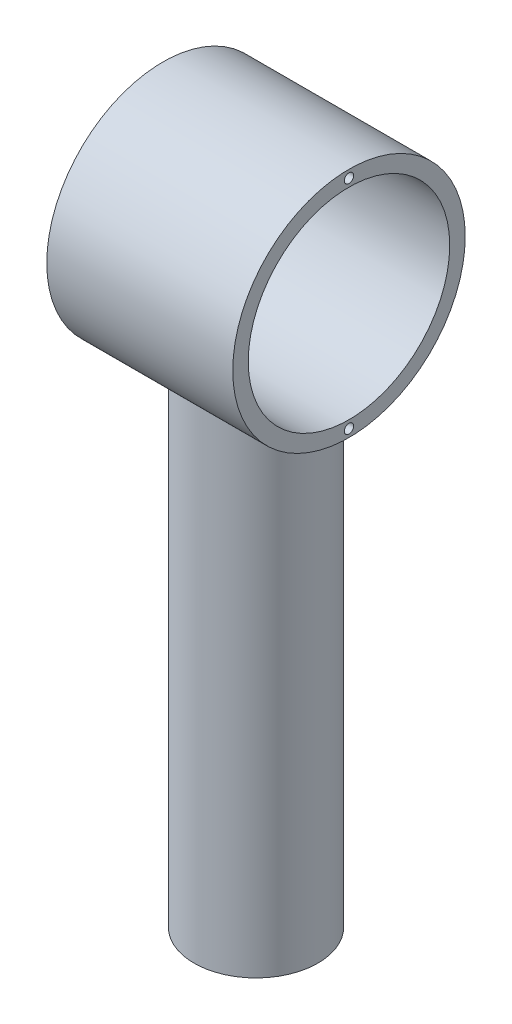
ISO-10303-21;
HEADER;
FILE_DESCRIPTION(('STEP AP214'),'2;1');
FILE_NAME('part.step','',(''),(''),'','','');
FILE_SCHEMA(('AUTOMOTIVE_DESIGN { 1 0 10303 214 1 1 1 1 }'));
ENDSEC;
DATA;
#1=APPLICATION_CONTEXT('core data for automotive mechanical design processes');
#2=APPLICATION_PROTOCOL_DEFINITION('international standard','automotive_design',2000,#1);
#3=PRODUCT_CONTEXT('',#1,'mechanical');
#4=PRODUCT('Part','Part','',(#3));
#5=PRODUCT_RELATED_PRODUCT_CATEGORY('part','',(#4));
#6=PRODUCT_DEFINITION_FORMATION('','',#4);
#7=PRODUCT_DEFINITION_CONTEXT('part definition',#1,'design');
#8=PRODUCT_DEFINITION('design','',#6,#7);
#9=PRODUCT_DEFINITION_SHAPE('','',#8);
#10=(LENGTH_UNIT() NAMED_UNIT(*) SI_UNIT(.MILLI.,.METRE.));
#11=(NAMED_UNIT(*) PLANE_ANGLE_UNIT() SI_UNIT($,.RADIAN.));
#12=(NAMED_UNIT(*) SI_UNIT($,.STERADIAN.) SOLID_ANGLE_UNIT());
#13=UNCERTAINTY_MEASURE_WITH_UNIT(LENGTH_MEASURE(1.E-05),#10,'distance_accuracy_value','');
#14=(GEOMETRIC_REPRESENTATION_CONTEXT(3) GLOBAL_UNCERTAINTY_ASSIGNED_CONTEXT((#13)) GLOBAL_UNIT_ASSIGNED_CONTEXT((#10,
#11,#12)) REPRESENTATION_CONTEXT('',''));
#15=CARTESIAN_POINT('',(0.,0.,0.));
#16=DIRECTION('',(0.,0.,1.));
#17=DIRECTION('',(1.,0.,0.));
#18=AXIS2_PLACEMENT_3D('',#15,#16,#17);
#19=CARTESIAN_POINT('',(30.,39.3347293897193,0.));
#20=DIRECTION('',(-1.,0.,0.));
#21=DIRECTION('',(0.,0.,1.));
#22=AXIS2_PLACEMENT_3D('',#19,#20,#21);
#23=CYLINDRICAL_SURFACE('',#22,37.5);
#24=CARTESIAN_POINT('',(0.,7.61328553859548,-20.));
#25=CARTESIAN_POINT('',(-0.51570182078703,7.6132880699644,-20.0000020694901));
#26=CARTESIAN_POINT('',(-1.03138048086282,7.60066823523603,-19.9800293716016));
#27=CARTESIAN_POINT('',(-2.05864988227541,7.55069636760927,-19.900438433849));
#28=CARTESIAN_POINT('',(-2.57023901293608,7.51333503324412,-19.8408052837619));
#29=CARTESIAN_POINT('',(-3.58588736208425,7.4152585886438,-19.6826321785822));
#30=CARTESIAN_POINT('',(-4.08993349078951,7.35450688776835,-19.5840312579613));
#31=CARTESIAN_POINT('',(-5.08606982289711,7.2119173548362,-19.3492573673804));
#32=CARTESIAN_POINT('',(-5.57816083404603,7.13008095172584,-19.2130869435256));
#33=CARTESIAN_POINT('',(-6.54451950031659,6.94867128669877,-18.9056831081237));
#34=CARTESIAN_POINT('',(-7.01887598033731,6.84920676482473,-18.7346637469901));
#35=CARTESIAN_POINT('',(-7.95042793399519,6.63528396459707,-18.3587310871486));
#36=CARTESIAN_POINT('',(-8.40762317654205,6.52082548443047,-18.1538173322254));
#37=CARTESIAN_POINT('',(-9.30288077314572,6.280113119196,-17.7117378683888));
#38=CARTESIAN_POINT('',(-9.7409430177589,6.15385916666921,-17.4745719750203));
#39=CARTESIAN_POINT('',(-10.5963194801134,5.89274883388715,-16.9695240952738));
#40=CARTESIAN_POINT('',(-11.0136317584403,5.75789165220258,-16.7016392454284));
#41=CARTESIAN_POINT('',(-11.8645739174769,5.46965896243555,-16.1097902433487));
#42=CARTESIAN_POINT('',(-12.2959988155331,5.31574005112918,-15.7829171398827));
#43=CARTESIAN_POINT('',(-13.1302687696288,5.00538236736176,-15.0959577863311));
#44=CARTESIAN_POINT('',(-13.5331236847503,4.84894448725216,-14.7358830932635));
#45=CARTESIAN_POINT('',(-14.3089302194614,4.53718321222723,-13.983797171619));
#46=CARTESIAN_POINT('',(-14.6818598793333,4.38186071053715,-13.5917629081743));
#47=CARTESIAN_POINT('',(-15.3955976257313,4.07610720045685,-12.7776616216099));
#48=CARTESIAN_POINT('',(-15.7364045621611,3.9256763673302,-12.3555935241317));
#49=CARTESIAN_POINT('',(-16.4096071243127,3.62159504628239,-11.4485193546584));
#50=CARTESIAN_POINT('',(-16.7391795739264,3.46863951891845,-10.9611773223788));
#51=CARTESIAN_POINT('',(-17.3557414498559,3.17677022398932,-9.95619250224608));
#52=CARTESIAN_POINT('',(-17.6427280097321,3.03785740183352,-9.43854767799109));
#53=CARTESIAN_POINT('',(-18.1710455089747,2.77814316417008,-8.37643552854965));
#54=CARTESIAN_POINT('',(-18.41240146501,2.65733183222565,-7.83198310803149));
#55=CARTESIAN_POINT('',(-18.8467311540172,2.43738288695592,-6.71989087808538));
#56=CARTESIAN_POINT('',(-19.0397108691608,2.33824259399959,-6.15225394574328));
#57=CARTESIAN_POINT('',(-19.3613843695543,2.17163162893653,-5.04409084493633));
#58=CARTESIAN_POINT('',(-19.4939561926983,2.10227597479069,-4.50497266267378));
#59=CARTESIAN_POINT('',(-19.7140932565086,1.98654763965169,-3.41518253756319));
#60=CARTESIAN_POINT('',(-19.8016606717114,1.9401738482179,-2.86451115428459));
#61=CARTESIAN_POINT('',(-19.9305089797469,1.87178493678521,-1.75660288316389));
#62=CARTESIAN_POINT('',(-19.9718172176824,1.84975542629783,-1.19937007105454));
#63=CARTESIAN_POINT('',(-20.0076218669366,1.83066715768317,-0.0829912230449223));
#64=CARTESIAN_POINT('',(-20.0021216831258,1.83360658330163,0.476154670739197));
#65=CARTESIAN_POINT('',(-19.9472644127489,1.86283417630171,1.53619969533));
#66=CARTESIAN_POINT('',(-19.9022922570022,1.88678776447231,2.03739765283052));
#67=CARTESIAN_POINT('',(-19.7749621587987,1.95430394753898,3.03364583244079));
#68=CARTESIAN_POINT('',(-19.6926072248326,1.99786496446631,3.52869654597525));
#69=CARTESIAN_POINT('',(-19.4914513891179,2.10356816382798,4.50931008296979));
#70=CARTESIAN_POINT('',(-19.3726492483943,2.16571097792434,4.99487258329354));
#71=CARTESIAN_POINT('',(-19.0998645810979,2.30715542449527,5.95344599270102));
#72=CARTESIAN_POINT('',(-18.9458807186661,2.38645770851321,6.42645642441812));
#73=CARTESIAN_POINT('',(-18.6021940192179,2.56151225269992,7.36274655171216));
#74=CARTESIAN_POINT('',(-18.4120876761664,2.65744915384273,7.82584330093237));
#75=CARTESIAN_POINT('',(-17.9990703595971,2.86303540513644,8.73397464778428));
#76=CARTESIAN_POINT('',(-17.7761594997008,2.97268470779299,9.17900930796887));
#77=CARTESIAN_POINT('',(-17.2992035665849,3.20345648806732,10.0490666696836));
#78=CARTESIAN_POINT('',(-17.0451518693495,3.32458140543233,10.4740850868216));
#79=CARTESIAN_POINT('',(-16.5076300698118,3.57587866384264,11.3022971689998));
#80=CARTESIAN_POINT('',(-16.2241573265239,3.70605181675742,11.7054888698094));
#81=CARTESIAN_POINT('',(-15.5985893577811,3.98674568958366,12.5291017597988));
#82=CARTESIAN_POINT('',(-15.2534633423082,4.13797742844741,12.9469820282129));
#83=CARTESIAN_POINT('',(-14.5313798049263,4.44484295747273,13.7525145719855));
#84=CARTESIAN_POINT('',(-14.1544203560153,4.60047701374398,14.1401650146785));
#85=CARTESIAN_POINT('',(-13.3701405977241,4.91262663007434,14.8839378037101));
#86=CARTESIAN_POINT('',(-12.9627935496855,5.06914285172146,15.2400317655331));
#87=CARTESIAN_POINT('',(-12.3307195861961,5.30153569487148,15.7488582454633));
#88=CARTESIAN_POINT('',(-12.116510807287,5.37860595092003,15.9142538119811));
#89=CARTESIAN_POINT('',(-11.681195108966,5.53149327670738,16.2364723560311));
#90=CARTESIAN_POINT('',(-11.460086037774,5.60730994402196,16.3932926166317));
#91=CARTESIAN_POINT('',(-10.7512386458969,5.84397514109671,16.8746465090342));
#92=CARTESIAN_POINT('',(-10.2513083612089,6.00159901702219,17.1830498160679));
#93=CARTESIAN_POINT('',(-9.22309815410546,6.30331720299424,17.7561472395889));
#94=CARTESIAN_POINT('',(-8.69482088095189,6.44741277392444,18.0208454312885));
#95=CARTESIAN_POINT('',(-7.88366626468449,6.64935618490528,18.3830210735658));
#96=CARTESIAN_POINT('',(-7.61021828324999,6.71429172444382,18.497913664606));
#97=CARTESIAN_POINT('',(-7.05750140500056,6.83879429917899,18.715766604051));
#98=CARTESIAN_POINT('',(-6.77823400271512,6.89836269233171,18.8187299725957));
#99=CARTESIAN_POINT('',(-5.93231320321243,7.0680650478359,19.1092351768966));
#100=CARTESIAN_POINT('',(-5.35737558916738,7.16923807530391,19.2784662419717));
#101=CARTESIAN_POINT('',(-4.23790937229369,7.33584327360834,19.553644852043));
#102=CARTESIAN_POINT('',(-3.69469269630252,7.40350754882363,19.6636096891331));
#103=CARTESIAN_POINT('',(-2.59831392694322,7.51172052869058,19.8382645405692));
#104=CARTESIAN_POINT('',(-2.04515244738685,7.55227090100259,19.9029573394163));
#105=CARTESIAN_POINT('',(-0.934456021777517,7.60436975146174,19.985912455731));
#106=CARTESIAN_POINT('',(-0.376925082364807,7.61594224913097,20.0042132273243));
#107=CARTESIAN_POINT('',(0.737521490785031,7.60960405604995,19.9941613677195));
#108=CARTESIAN_POINT('',(1.29443717682133,7.59169610124954,19.9658130658148));
#109=CARTESIAN_POINT('',(2.32861782358089,7.53154939769093,19.8698354015943));
#110=CARTESIAN_POINT('',(2.80663609459942,7.49285872051378,19.807924313161));
#111=CARTESIAN_POINT('',(3.75490327816776,7.39530343572092,19.6502332853426));
#112=CARTESIAN_POINT('',(4.22515302415459,7.33644100713542,19.5544570041705));
#113=CARTESIAN_POINT('',(5.15517852611524,7.20041592332948,19.3301078005834));
#114=CARTESIAN_POINT('',(5.6149510025583,7.12324762206767,19.201524758723));
#115=CARTESIAN_POINT('',(6.52146009102425,6.95292610209488,18.9128757451853));
#116=CARTESIAN_POINT('',(6.9681958338559,6.85977182039513,18.7528076798059));
#117=CARTESIAN_POINT('',(7.86590665438222,6.65563689578103,18.394868382629));
#118=CARTESIAN_POINT('',(8.31620402945305,6.54405241736956,18.1956441409796));
#119=CARTESIAN_POINT('',(9.19863635779434,6.30922572449742,17.7658681503462));
#120=CARTESIAN_POINT('',(9.63076356428131,6.18597860906466,17.5353032131866));
#121=CARTESIAN_POINT('',(10.4751592846687,5.9308834237878,17.0443420482752));
#122=CARTESIAN_POINT('',(10.8874241815632,5.79903379760681,16.7839404160909));
#123=CARTESIAN_POINT('',(11.6906450394737,5.52972993234768,16.234702654998));
#124=CARTESIAN_POINT('',(12.0815992232859,5.39227522750069,15.9458641602208));
#125=CARTESIAN_POINT('',(12.8968327162095,5.09419926730205,15.2964635816017));
#126=CARTESIAN_POINT('',(13.3175400727492,4.93314757086699,14.931603315024));
#127=CARTESIAN_POINT('',(14.1272437684801,4.61166900271007,14.167947195493));
#128=CARTESIAN_POINT('',(14.5162373768361,4.45124218592611,13.7691484261636));
#129=CARTESIAN_POINT('',(15.260632807053,4.13496611295089,12.9392398085584));
#130=CARTESIAN_POINT('',(15.6160178550132,3.97911916902201,12.5081140164347));
#131=CARTESIAN_POINT('',(16.2907536419708,3.67596031043994,11.6156902573406));
#132=CARTESIAN_POINT('',(16.610104394801,3.52864839251033,11.154392301953));
#133=CARTESIAN_POINT('',(17.2229254898073,3.24036680527126,10.183991767619));
#134=CARTESIAN_POINT('',(17.514759715978,3.09991832994598,9.67369760070825));
#135=CARTESIAN_POINT('',(18.0538993037871,2.83626399048115,8.62576948259296));
#136=CARTESIAN_POINT('',(18.3012025928681,2.71305892894344,8.08813426037458));
#137=CARTESIAN_POINT('',(18.7482234390732,2.48763118452518,6.98966501489584));
#138=CARTESIAN_POINT('',(18.9479790657331,2.38539172446142,6.42884997594815));
#139=CARTESIAN_POINT('',(19.297455902112,2.20496544127273,5.28809092848529));
#140=CARTESIAN_POINT('',(19.4471840388594,2.12677528829321,4.70814958051198));
#141=CARTESIAN_POINT('',(19.6821437839116,2.00340406914947,3.59240502635107));
#142=CARTESIAN_POINT('',(19.772289467478,1.95572325345381,3.05790886541163));
#143=CARTESIAN_POINT('',(19.9089530850035,1.88325369864124,1.98183214986327));
#144=CARTESIAN_POINT('',(19.9554739590957,1.85846341679803,1.44025207517587));
#145=CARTESIAN_POINT('',(20.0042303784103,1.83247863443271,0.354749121186357));
#146=CARTESIAN_POINT('',(20.0064830368679,1.83127501576367,-0.189172771475614));
#147=CARTESIAN_POINT('',(19.9667133892609,1.85247557522932,-1.27491994456974));
#148=CARTESIAN_POINT('',(19.924692919087,1.87487877445111,-1.81674531100427));
#149=CARTESIAN_POINT('',(19.8021741343333,1.93989452502643,-2.84994112337194));
#150=CARTESIAN_POINT('',(19.7250802887853,1.98071677905486,-3.34183352060926));
#151=CARTESIAN_POINT('',(19.5349170787364,2.08078402472055,-4.31666546450881));
#152=CARTESIAN_POINT('',(19.4218501893373,2.14002774887424,-4.79960562470527));
#153=CARTESIAN_POINT('',(19.1609304561323,2.2756030999327,-5.75354734954822));
#154=CARTESIAN_POINT('',(19.013075402407,2.35193581240119,-6.22454815364019));
#155=CARTESIAN_POINT('',(18.6840113486702,2.52002741658279,-7.15191066342813));
#156=CARTESIAN_POINT('',(18.5028007591816,2.61178704341008,-7.60827167028258));
#157=CARTESIAN_POINT('',(18.1011724085677,2.81252984845167,-8.52087859171125));
#158=CARTESIAN_POINT('',(17.8795354415977,2.9220313921495,-8.97647337098125));
#159=CARTESIAN_POINT('',(17.4038544118732,3.1532292750963,-9.86715686443598));
#160=CARTESIAN_POINT('',(17.1498098908654,3.27492578678086,-10.302245288535));
#161=CARTESIAN_POINT('',(16.6110188950497,3.52803481329824,-11.1501774118709));
#162=CARTESIAN_POINT('',(16.326263208179,3.65945023966245,-11.5630143806002));
#163=CARTESIAN_POINT('',(15.7278002398746,3.92932914281693,-12.364731365233));
#164=CARTESIAN_POINT('',(15.4140900152394,4.06779333546474,-12.7536089389721));
#165=CARTESIAN_POINT('',(14.7231741657298,4.36454119290665,-13.5475000625257));
#166=CARTESIAN_POINT('',(14.3427819832896,4.52332570635551,-13.9495579337108));
#167=CARTESIAN_POINT('',(13.5503054853644,4.8422779960791,-14.7205601593971));
#168=CARTESIAN_POINT('',(13.1382187825437,5.00244587574532,-15.0895020149462));
#169=CARTESIAN_POINT('',(12.2838013095431,5.32025654018632,-15.7928698949614));
#170=CARTESIAN_POINT('',(11.8414372203949,5.47789629962482,-16.1272568440539));
#171=CARTESIAN_POINT('',(10.928825106116,5.78618549533389,-16.7591408544251));
#172=CARTESIAN_POINT('',(10.4585786781072,5.93683533111324,-17.0566400256525));
#173=CARTESIAN_POINT('',(9.4660459672117,6.23457796367636,-17.6277979510643));
#174=CARTESIAN_POINT('',(8.94232063328413,6.3810371109805,-17.8992953962635));
#175=CARTESIAN_POINT('',(7.86886091086252,6.65599199411329,-18.3964918948525));
#176=CARTESIAN_POINT('',(7.31912211873666,6.78448467386223,-18.6221831595937));
#177=CARTESIAN_POINT('',(6.19886278931986,7.01791071629903,-19.024384907481));
#178=CARTESIAN_POINT('',(5.62840595658142,7.12291019016861,-19.201033745358));
#179=CARTESIAN_POINT('',(4.47007390274586,7.30497875372796,-19.5032386917275));
#180=CARTESIAN_POINT('',(3.88221048468111,7.3820663210496,-19.6288286079236));
#181=CARTESIAN_POINT('',(2.7470780378961,7.49911189520011,-19.8180391560448));
#182=CARTESIAN_POINT('',(2.20083618219898,7.54175781178129,-19.8861700850289));
#183=CARTESIAN_POINT('',(1.10305418721149,7.59884381135044,-19.9771502535946));
#184=CARTESIAN_POINT('',(0.55151384904951,7.61328283143998,-19.9999977867977));
#185=CARTESIAN_POINT('',(0.,7.61328553859548,-20.));
#186=B_SPLINE_CURVE_WITH_KNOTS('',3,(#24,#25,#26,#27,#28,#29,#30,#31,#32,#33,#34,#35,#36,#37,
#38,#39,#40,#41,#42,#43,#44,#45,#46,#47,#48,#49,#50,#51,#52,#53,#54,#55,#56,#57,#58,#59,#60,#61,
#62,#63,#64,#65,#66,#67,#68,#69,#70,#71,#72,#73,#74,#75,#76,#77,#78,#79,#80,#81,#82,#83,#84,#85,
#86,#87,#88,#89,#90,#91,#92,#93,#94,#95,#96,#97,#98,#99,#100,#101,#102,#103,#104,#105,#106,#107,
#108,#109,#110,#111,#112,#113,#114,#115,#116,#117,#118,#119,#120,#121,#122,#123,#124,#125,#126,
#127,#128,#129,#130,#131,#132,#133,#134,#135,#136,#137,#138,#139,#140,#141,#142,#143,#144,#145,
#146,#147,#148,#149,#150,#151,#152,#153,#154,#155,#156,#157,#158,#159,#160,#161,#162,#163,#164,
#165,#166,#167,#168,#169,#170,#171,#172,#173,#174,#175,#176,#177,#178,#179,#180,#181,#182,#183,
#184,#185),.UNSPECIFIED.,.T.,.F.,(4,2,2,2,2,2,2,2,2,2,2,2,2,2,2,2,2,2,2,2,2,2,2,2,2,2,2,2,2,2,2,
2,2,2,2,2,2,2,2,2,2,2,2,2,2,2,2,2,2,2,2,2,2,2,2,2,2,2,2,2,2,2,2,2,2,2,2,2,2,2,2,2,2,2,2,2,2,2,2,
2,4),(0.,1.54653102412566,3.0936437906582,4.6431866763651,6.19262457451161,7.73281777044317,
9.27303169891885,10.8132544364963,12.3536208628203,14.040050545629,15.7258954056102,
17.4129662674639,19.1000975089252,20.9213689398888,22.7427629043674,24.5631553877423,
26.3833226515055,28.059489973695,29.7355762987162,31.4106713180379,33.0856444910623,
34.5951981761441,36.1046303969191,37.6141139345514,39.1236547971856,40.6511712473975,
42.1786824070403,43.7065190516389,45.2344929615787,46.9207293716491,48.6070679294707,
50.2949082420574,51.1388926875629,51.9831430032304,53.8052600800145,55.6272071603968,
56.5377943533881,57.448150505485,59.2683063920866,60.9409458022714,62.6134823260862,
64.2846320385256,65.9556266677268,67.4046488518205,68.853514556278,70.3028277136487,
71.7522372805584,73.2653941231695,74.7791896853173,76.2932598817077,77.8074561511926,
79.544658326591,81.2820099328677,83.0202241182139,84.7584376362927,86.5691871795349,
88.3800209768545,90.189399997079,91.9985283787263,93.628739619584,95.2588409829981,
96.8883121683758,98.5177157865105,100.014703624748,101.511588485983,103.008568462574,
104.505619792595,106.059030766784,107.612463709144,109.166363919111,110.720422255902,
112.445990412954,114.171688673013,115.899317510118,117.626847482728,119.447862072683,
121.269186039717,123.085318370938,124.900246218139,126.554111116078,128.208038334114),.UNSPECIFIED.);
#187=CARTESIAN_POINT('',(0.,7.61328553859548,-20.));
#188=VERTEX_POINT('',#187);
#189=EDGE_CURVE('E12',#188,#188,#186,.T.);
#190=ORIENTED_EDGE('',*,*,#189,.T.);
#191=EDGE_LOOP('',(#190));
#192=FACE_BOUND('',#191,.T.);
#193=CARTESIAN_POINT('',(-30.,39.3347293897193,0.));
#194=DIRECTION('',(1.,0.,0.));
#195=DIRECTION('',(0.,0.,-1.));
#196=AXIS2_PLACEMENT_3D('',#193,#194,#195);
#197=CIRCLE('',#196,37.5);
#198=CARTESIAN_POINT('',(-30.,39.3347293897193,-37.5));
#199=VERTEX_POINT('',#198);
#200=EDGE_CURVE('E122',#199,#199,#197,.T.);
#201=ORIENTED_EDGE('',*,*,#200,.T.);
#202=EDGE_LOOP('',(#201));
#203=FACE_BOUND('',#202,.T.);
#204=CARTESIAN_POINT('',(30.,39.3347293897193,0.));
#205=DIRECTION('',(1.,0.,0.));
#206=DIRECTION('',(0.,0.,-1.));
#207=AXIS2_PLACEMENT_3D('',#204,#205,#206);
#208=CIRCLE('',#207,37.5);
#209=CARTESIAN_POINT('',(30.,39.3347293897193,-37.5));
#210=VERTEX_POINT('',#209);
#211=EDGE_CURVE('E346',#210,#210,#208,.T.);
#212=ORIENTED_EDGE('',*,*,#211,.F.);
#213=EDGE_LOOP('',(#212));
#214=FACE_BOUND('',#213,.T.);
#215=ADVANCED_FACE('F49',(#192,#203,#214),#23,.T.);
#216=CARTESIAN_POINT('',(0.,25.,0.));
#217=DIRECTION('',(0.,-1.,0.));
#218=DIRECTION('',(0.,0.,-1.));
#219=AXIS2_PLACEMENT_3D('',#216,#217,#218);
#220=CYLINDRICAL_SURFACE('',#219,20.);
#221=CARTESIAN_POINT('',(0.,-150.,0.));
#222=DIRECTION('',(0.,-1.,0.));
#223=DIRECTION('',(0.,0.,-1.));
#224=AXIS2_PLACEMENT_3D('',#221,#222,#223);
#225=CIRCLE('',#224,20.);
#226=CARTESIAN_POINT('',(0.,-150.,-20.));
#227=VERTEX_POINT('',#226);
#228=EDGE_CURVE('E145',#227,#227,#225,.T.);
#229=ORIENTED_EDGE('',*,*,#228,.F.);
#230=EDGE_LOOP('',(#229));
#231=FACE_BOUND('',#230,.T.);
#232=ORIENTED_EDGE('',*,*,#189,.F.);
#233=EDGE_LOOP('',(#232));
#234=FACE_BOUND('',#233,.T.);
#235=ADVANCED_FACE('F51',(#231,#234),#220,.T.);
#236=CARTESIAN_POINT('',(12.5,-75.,0.));
#237=DIRECTION('',(1.,0.,0.));
#238=DIRECTION('',(0.,0.,-1.));
#239=AXIS2_PLACEMENT_3D('',#236,#237,#238);
#240=PLANE('',#239);
#241=DIRECTION('',(0.,-1.,0.));
#242=VECTOR('',#241,1.);
#243=CARTESIAN_POINT('',(12.5,-75.,-7.21687836487032));
#244=LINE('',#243,#242);
#245=CARTESIAN_POINT('',(12.5,-75.,-7.21687836487032));
#246=VERTEX_POINT('',#245);
#247=CARTESIAN_POINT('',(12.5,-150.,-7.2168783648703));
#248=VERTEX_POINT('',#247);
#249=EDGE_CURVE('E63',#246,#248,#244,.T.);
#250=ORIENTED_EDGE('',*,*,#249,.T.);
#251=DIRECTION('',(0.,0.,1.));
#252=VECTOR('',#251,1.);
#253=CARTESIAN_POINT('',(12.5,-150.,-7.2168783648703));
#254=LINE('',#253,#252);
#255=CARTESIAN_POINT('',(12.5,-150.,7.21687836487038));
#256=VERTEX_POINT('',#255);
#257=EDGE_CURVE('E127',#248,#256,#254,.T.);
#258=ORIENTED_EDGE('',*,*,#257,.T.);
#259=DIRECTION('',(0.,-1.,0.));
#260=VECTOR('',#259,1.);
#261=CARTESIAN_POINT('',(12.5,-75.,7.21687836487033));
#262=LINE('',#261,#260);
#263=CARTESIAN_POINT('',(12.5,-75.,7.21687836487033));
#264=VERTEX_POINT('',#263);
#265=EDGE_CURVE('E170',#264,#256,#262,.T.);
#266=ORIENTED_EDGE('',*,*,#265,.F.);
#267=DIRECTION('',(0.,0.,1.));
#268=VECTOR('',#267,1.);
#269=CARTESIAN_POINT('',(12.5,-75.,0.));
#270=LINE('',#269,#268);
#271=EDGE_CURVE('E149',#246,#264,#270,.T.);
#272=ORIENTED_EDGE('',*,*,#271,.F.);
#273=EDGE_LOOP('',(#250,#258,#266,#272));
#274=FACE_BOUND('',#273,.T.);
#275=ADVANCED_FACE('F186',(#274),#240,.F.);
#276=CARTESIAN_POINT('',(6.25,-75.,-10.8253175473055));
#277=DIRECTION('',(0.5,0.,-0.866025403784439));
#278=DIRECTION('',(-0.866025403784439,0.,-0.5));
#279=AXIS2_PLACEMENT_3D('',#276,#277,#278);
#280=PLANE('',#279);
#281=DIRECTION('',(0.,-1.,0.));
#282=VECTOR('',#281,1.);
#283=CARTESIAN_POINT('',(0.,-75.,-14.4337567297407));
#284=LINE('',#283,#282);
#285=CARTESIAN_POINT('',(0.,-75.,-14.4337567297407));
#286=VERTEX_POINT('',#285);
#287=CARTESIAN_POINT('',(0.,-150.,-14.4337567297407));
#288=VERTEX_POINT('',#287);
#289=EDGE_CURVE('E77',#286,#288,#284,.T.);
#290=ORIENTED_EDGE('',*,*,#289,.T.);
#291=DIRECTION('',(0.866025403784438,0.,0.500000000000001));
#292=VECTOR('',#291,1.);
#293=CARTESIAN_POINT('',(0.,-150.,-14.4337567297407));
#294=LINE('',#293,#292);
#295=EDGE_CURVE('E108',#288,#248,#294,.T.);
#296=ORIENTED_EDGE('',*,*,#295,.T.);
#297=ORIENTED_EDGE('',*,*,#249,.F.);
#298=DIRECTION('',(0.866025403784439,0.,0.5));
#299=VECTOR('',#298,1.);
#300=CARTESIAN_POINT('',(6.25,-75.,-10.8253175473055));
#301=LINE('',#300,#299);
#302=EDGE_CURVE('E111',#286,#246,#301,.T.);
#303=ORIENTED_EDGE('',*,*,#302,.F.);
#304=EDGE_LOOP('',(#290,#296,#297,#303));
#305=FACE_BOUND('',#304,.T.);
#306=ADVANCED_FACE('F106',(#305),#280,.F.);
#307=CARTESIAN_POINT('',(-6.25000000000001,-75.,-10.8253175473055));
#308=DIRECTION('',(-0.5,0.,-0.866025403784438));
#309=DIRECTION('',(-0.866025403784439,0.,0.5));
#310=AXIS2_PLACEMENT_3D('',#307,#308,#309);
#311=PLANE('',#310);
#312=DIRECTION('',(0.,-1.,0.));
#313=VECTOR('',#312,1.);
#314=CARTESIAN_POINT('',(-12.5,-75.,-7.21687836487032));
#315=LINE('',#314,#313);
#316=CARTESIAN_POINT('',(-12.5,-75.,-7.21687836487032));
#317=VERTEX_POINT('',#316);
#318=CARTESIAN_POINT('',(-12.4999999999999,-150.,-7.21687836487047));
#319=VERTEX_POINT('',#318);
#320=EDGE_CURVE('E113',#317,#319,#315,.T.);
#321=ORIENTED_EDGE('',*,*,#320,.T.);
#322=DIRECTION('',(0.866025403784441,0.,-0.499999999999995));
#323=VECTOR('',#322,1.);
#324=CARTESIAN_POINT('',(-12.4999999999999,-150.,-7.21687836487047));
#325=LINE('',#324,#323);
#326=EDGE_CURVE('E116',#319,#288,#325,.T.);
#327=ORIENTED_EDGE('',*,*,#326,.T.);
#328=ORIENTED_EDGE('',*,*,#289,.F.);
#329=DIRECTION('',(0.866025403784439,0.,-0.5));
#330=VECTOR('',#329,1.);
#331=CARTESIAN_POINT('',(-6.25000000000001,-75.,-10.8253175473055));
#332=LINE('',#331,#330);
#333=EDGE_CURVE('E165',#317,#286,#332,.T.);
#334=ORIENTED_EDGE('',*,*,#333,.F.);
#335=EDGE_LOOP('',(#321,#327,#328,#334));
#336=FACE_BOUND('',#335,.T.);
#337=ADVANCED_FACE('F117',(#336),#311,.F.);
#338=CARTESIAN_POINT('',(-12.5,-75.,0.));
#339=DIRECTION('',(-1.,0.,0.));
#340=DIRECTION('',(0.,0.,1.));
#341=AXIS2_PLACEMENT_3D('',#338,#339,#340);
#342=PLANE('',#341);
#343=DIRECTION('',(0.,-1.,0.));
#344=VECTOR('',#343,1.);
#345=CARTESIAN_POINT('',(-12.5,-75.,7.21687836487033));
#346=LINE('',#345,#344);
#347=CARTESIAN_POINT('',(-12.5,-75.,7.21687836487033));
#348=VERTEX_POINT('',#347);
#349=CARTESIAN_POINT('',(-12.5000000000001,-150.,7.21687836487021));
#350=VERTEX_POINT('',#349);
#351=EDGE_CURVE('E175',#348,#350,#346,.T.);
#352=ORIENTED_EDGE('',*,*,#351,.T.);
#353=DIRECTION('',(0.,0.,-1.));
#354=VECTOR('',#353,1.);
#355=CARTESIAN_POINT('',(-12.5000000000001,-150.,7.21687836487021));
#356=LINE('',#355,#354);
#357=EDGE_CURVE('E142',#350,#319,#356,.T.);
#358=ORIENTED_EDGE('',*,*,#357,.T.);
#359=ORIENTED_EDGE('',*,*,#320,.F.);
#360=DIRECTION('',(0.,0.,-1.));
#361=VECTOR('',#360,1.);
#362=CARTESIAN_POINT('',(-12.5,-75.,0.));
#363=LINE('',#362,#361);
#364=EDGE_CURVE('E161',#348,#317,#363,.T.);
#365=ORIENTED_EDGE('',*,*,#364,.F.);
#366=EDGE_LOOP('',(#352,#358,#359,#365));
#367=FACE_BOUND('',#366,.T.);
#368=ADVANCED_FACE('F194',(#367),#342,.F.);
#369=CARTESIAN_POINT('',(-6.25,-75.,10.8253175473055));
#370=DIRECTION('',(-0.5,0.,0.866025403784439));
#371=DIRECTION('',(0.866025403784439,0.,0.5));
#372=AXIS2_PLACEMENT_3D('',#369,#370,#371);
#373=PLANE('',#372);
#374=DIRECTION('',(0.,-1.,0.));
#375=VECTOR('',#374,1.);
#376=CARTESIAN_POINT('',(0.,-75.,14.4337567297406));
#377=LINE('',#376,#375);
#378=CARTESIAN_POINT('',(0.,-75.,14.4337567297406));
#379=VERTEX_POINT('',#378);
#380=CARTESIAN_POINT('',(0.,-150.,14.4337567297407));
#381=VERTEX_POINT('',#380);
#382=EDGE_CURVE('E178',#379,#381,#377,.T.);
#383=ORIENTED_EDGE('',*,*,#382,.T.);
#384=DIRECTION('',(-0.866025403784435,0.,-0.500000000000007));
#385=VECTOR('',#384,1.);
#386=CARTESIAN_POINT('',(0.,-150.,14.4337567297407));
#387=LINE('',#386,#385);
#388=EDGE_CURVE('E138',#381,#350,#387,.T.);
#389=ORIENTED_EDGE('',*,*,#388,.T.);
#390=ORIENTED_EDGE('',*,*,#351,.F.);
#391=DIRECTION('',(-0.866025403784439,0.,-0.5));
#392=VECTOR('',#391,1.);
#393=CARTESIAN_POINT('',(-6.25,-75.,10.8253175473055));
#394=LINE('',#393,#392);
#395=EDGE_CURVE('E157',#379,#348,#394,.T.);
#396=ORIENTED_EDGE('',*,*,#395,.F.);
#397=EDGE_LOOP('',(#383,#389,#390,#396));
#398=FACE_BOUND('',#397,.T.);
#399=ADVANCED_FACE('F188',(#398),#373,.F.);
#400=CARTESIAN_POINT('',(6.25000000000001,-75.,10.8253175473055));
#401=DIRECTION('',(0.5,0.,0.866025403784439));
#402=DIRECTION('',(0.866025403784439,0.,-0.5));
#403=AXIS2_PLACEMENT_3D('',#400,#401,#402);
#404=PLANE('',#403);
#405=ORIENTED_EDGE('',*,*,#265,.T.);
#406=DIRECTION('',(-0.866025403784441,0.,0.499999999999995));
#407=VECTOR('',#406,1.);
#408=CARTESIAN_POINT('',(12.5,-150.,7.21687836487038));
#409=LINE('',#408,#407);
#410=EDGE_CURVE('E131',#256,#381,#409,.T.);
#411=ORIENTED_EDGE('',*,*,#410,.T.);
#412=ORIENTED_EDGE('',*,*,#382,.F.);
#413=DIRECTION('',(-0.866025403784439,0.,0.5));
#414=VECTOR('',#413,1.);
#415=CARTESIAN_POINT('',(6.25000000000001,-75.,10.8253175473055));
#416=LINE('',#415,#414);
#417=EDGE_CURVE('E153',#264,#379,#416,.T.);
#418=ORIENTED_EDGE('',*,*,#417,.F.);
#419=EDGE_LOOP('',(#405,#411,#412,#418));
#420=FACE_BOUND('',#419,.T.);
#421=ADVANCED_FACE('F183',(#420),#404,.F.);
#422=CARTESIAN_POINT('',(0.,-75.,0.));
#423=DIRECTION('',(0.,-1.,0.));
#424=DIRECTION('',(0.,0.,-1.));
#425=AXIS2_PLACEMENT_3D('',#422,#423,#424);
#426=PLANE('',#425);
#427=ORIENTED_EDGE('',*,*,#271,.T.);
#428=ORIENTED_EDGE('',*,*,#417,.T.);
#429=ORIENTED_EDGE('',*,*,#395,.T.);
#430=ORIENTED_EDGE('',*,*,#364,.T.);
#431=ORIENTED_EDGE('',*,*,#333,.T.);
#432=ORIENTED_EDGE('',*,*,#302,.T.);
#433=EDGE_LOOP('',(#427,#428,#429,#430,#431,#432));
#434=FACE_BOUND('',#433,.T.);
#435=ADVANCED_FACE('F192',(#434),#426,.T.);
#436=CARTESIAN_POINT('',(0.,-150.,0.));
#437=DIRECTION('',(0.,-1.,0.));
#438=DIRECTION('',(0.,0.,-1.));
#439=AXIS2_PLACEMENT_3D('',#436,#437,#438);
#440=PLANE('',#439);
#441=ORIENTED_EDGE('',*,*,#228,.T.);
#442=EDGE_LOOP('',(#441));
#443=FACE_BOUND('',#442,.T.);
#444=ORIENTED_EDGE('',*,*,#295,.F.);
#445=ORIENTED_EDGE('',*,*,#326,.F.);
#446=ORIENTED_EDGE('',*,*,#357,.F.);
#447=ORIENTED_EDGE('',*,*,#388,.F.);
#448=ORIENTED_EDGE('',*,*,#410,.F.);
#449=ORIENTED_EDGE('',*,*,#257,.F.);
#450=EDGE_LOOP('',(#444,#445,#446,#447,#448,#449));
#451=FACE_BOUND('',#450,.T.);
#452=ADVANCED_FACE('F124',(#443,#451),#440,.T.);
#453=CARTESIAN_POINT('',(-30.,39.3347293897193,0.));
#454=DIRECTION('',(1.,0.,0.));
#455=DIRECTION('',(0.,0.,-1.));
#456=AXIS2_PLACEMENT_3D('',#453,#454,#455);
#457=PLANE('',#456);
#458=ORIENTED_EDGE('',*,*,#200,.F.);
#459=EDGE_LOOP('',(#458));
#460=FACE_BOUND('',#459,.T.);
#461=ADVANCED_FACE('F215',(#460),#457,.F.);
#462=CARTESIAN_POINT('',(30.,39.3347293897193,0.));
#463=DIRECTION('',(1.,0.,0.));
#464=DIRECTION('',(0.,0.,-1.));
#465=AXIS2_PLACEMENT_3D('',#462,#463,#464);
#466=PLANE('',#465);
#467=CARTESIAN_POINT('',(30.,74.3347293897193,0.));
#468=DIRECTION('',(1.,0.,0.));
#469=DIRECTION('',(0.,0.,-1.));
#470=AXIS2_PLACEMENT_3D('',#467,#468,#469);
#471=CIRCLE('',#470,1.5);
#472=CARTESIAN_POINT('',(30.,74.3347293897193,-1.5));
#473=VERTEX_POINT('',#472);
#474=EDGE_CURVE('E341',#473,#473,#471,.T.);
#475=ORIENTED_EDGE('',*,*,#474,.F.);
#476=EDGE_LOOP('',(#475));
#477=FACE_BOUND('',#476,.T.);
#478=CARTESIAN_POINT('',(30.,4.33472938971928,0.));
#479=DIRECTION('',(1.,0.,0.));
#480=DIRECTION('',(0.,0.,-1.));
#481=AXIS2_PLACEMENT_3D('',#478,#479,#480);
#482=CIRCLE('',#481,1.5);
#483=CARTESIAN_POINT('',(30.,4.33472938971928,-1.5));
#484=VERTEX_POINT('',#483);
#485=EDGE_CURVE('E349',#484,#484,#482,.T.);
#486=ORIENTED_EDGE('',*,*,#485,.F.);
#487=EDGE_LOOP('',(#486));
#488=FACE_BOUND('',#487,.T.);
#489=CARTESIAN_POINT('',(30.,39.3347293897193,0.));
#490=DIRECTION('',(1.,0.,0.));
#491=DIRECTION('',(0.,0.,-1.));
#492=AXIS2_PLACEMENT_3D('',#489,#490,#491);
#493=CIRCLE('',#492,32.5);
#494=CARTESIAN_POINT('',(30.,39.3347293897193,-32.5));
#495=VERTEX_POINT('',#494);
#496=EDGE_CURVE('E340',#495,#495,#493,.T.);
#497=ORIENTED_EDGE('',*,*,#496,.F.);
#498=EDGE_LOOP('',(#497));
#499=FACE_BOUND('',#498,.T.);
#500=ORIENTED_EDGE('',*,*,#211,.T.);
#501=EDGE_LOOP('',(#500));
#502=FACE_BOUND('',#501,.T.);
#503=ADVANCED_FACE('F243',(#477,#488,#499,#502),#466,.T.);
#504=CARTESIAN_POINT('',(-20.,39.3347293897193,0.));
#505=DIRECTION('',(1.,0.,0.));
#506=DIRECTION('',(0.,0.,-1.));
#507=AXIS2_PLACEMENT_3D('',#504,#505,#506);
#508=PLANE('',#507);
#509=CARTESIAN_POINT('',(-20.,39.3347293897193,0.));
#510=DIRECTION('',(1.,0.,0.));
#511=DIRECTION('',(0.,0.,-1.));
#512=AXIS2_PLACEMENT_3D('',#509,#510,#511);
#513=CIRCLE('',#512,32.5);
#514=CARTESIAN_POINT('',(-20.,39.3347293897193,-32.5));
#515=VERTEX_POINT('',#514);
#516=EDGE_CURVE('E362',#515,#515,#513,.T.);
#517=ORIENTED_EDGE('',*,*,#516,.T.);
#518=EDGE_LOOP('',(#517));
#519=FACE_BOUND('',#518,.T.);
#520=ADVANCED_FACE('F255',(#519),#508,.T.);
#521=CARTESIAN_POINT('',(-20.,39.3347293897193,0.));
#522=DIRECTION('',(1.,0.,0.));
#523=DIRECTION('',(0.,0.,-1.));
#524=AXIS2_PLACEMENT_3D('',#521,#522,#523);
#525=CYLINDRICAL_SURFACE('',#524,32.5);
#526=ORIENTED_EDGE('',*,*,#516,.F.);
#527=EDGE_LOOP('',(#526));
#528=FACE_BOUND('',#527,.T.);
#529=ORIENTED_EDGE('',*,*,#496,.T.);
#530=EDGE_LOOP('',(#529));
#531=FACE_BOUND('',#530,.T.);
#532=ADVANCED_FACE('F258',(#528,#531),#525,.F.);
#533=CARTESIAN_POINT('',(20.,4.33472938971928,0.));
#534=DIRECTION('',(1.,0.,0.));
#535=DIRECTION('',(0.,0.,-1.));
#536=AXIS2_PLACEMENT_3D('',#533,#534,#535);
#537=CYLINDRICAL_SURFACE('',#536,1.5);
#538=CARTESIAN_POINT('',(20.,4.33472938971928,0.));
#539=DIRECTION('',(1.,0.,0.));
#540=DIRECTION('',(0.,0.,-1.));
#541=AXIS2_PLACEMENT_3D('',#538,#539,#540);
#542=CIRCLE('',#541,1.5);
#543=CARTESIAN_POINT('',(20.,4.33472938971928,-1.5));
#544=VERTEX_POINT('',#543);
#545=EDGE_CURVE('E355',#544,#544,#542,.T.);
#546=ORIENTED_EDGE('',*,*,#545,.F.);
#547=EDGE_LOOP('',(#546));
#548=FACE_BOUND('',#547,.T.);
#549=ORIENTED_EDGE('',*,*,#485,.T.);
#550=EDGE_LOOP('',(#549));
#551=FACE_BOUND('',#550,.T.);
#552=ADVANCED_FACE('F276',(#548,#551),#537,.F.);
#553=CARTESIAN_POINT('',(20.,4.33472938971928,0.));
#554=DIRECTION('',(1.,0.,0.));
#555=DIRECTION('',(0.,0.,-1.));
#556=AXIS2_PLACEMENT_3D('',#553,#554,#555);
#557=PLANE('',#556);
#558=ORIENTED_EDGE('',*,*,#545,.T.);
#559=EDGE_LOOP('',(#558));
#560=FACE_BOUND('',#559,.T.);
#561=ADVANCED_FACE('F293',(#560),#557,.T.);
#562=CARTESIAN_POINT('',(20.,74.3347293897193,0.));
#563=DIRECTION('',(1.,0.,0.));
#564=DIRECTION('',(0.,0.,-1.));
#565=AXIS2_PLACEMENT_3D('',#562,#563,#564);
#566=CYLINDRICAL_SURFACE('',#565,1.5);
#567=CARTESIAN_POINT('',(20.,74.3347293897193,0.));
#568=DIRECTION('',(1.,0.,0.));
#569=DIRECTION('',(0.,0.,-1.));
#570=AXIS2_PLACEMENT_3D('',#567,#568,#569);
#571=CIRCLE('',#570,1.5);
#572=CARTESIAN_POINT('',(20.,74.3347293897193,-1.5));
#573=VERTEX_POINT('',#572);
#574=EDGE_CURVE('E338',#573,#573,#571,.T.);
#575=ORIENTED_EDGE('',*,*,#574,.F.);
#576=EDGE_LOOP('',(#575));
#577=FACE_BOUND('',#576,.T.);
#578=ORIENTED_EDGE('',*,*,#474,.T.);
#579=EDGE_LOOP('',(#578));
#580=FACE_BOUND('',#579,.T.);
#581=ADVANCED_FACE('F304',(#577,#580),#566,.F.);
#582=CARTESIAN_POINT('',(20.,74.3347293897193,0.));
#583=DIRECTION('',(1.,0.,0.));
#584=DIRECTION('',(0.,0.,-1.));
#585=AXIS2_PLACEMENT_3D('',#582,#583,#584);
#586=PLANE('',#585);
#587=ORIENTED_EDGE('',*,*,#574,.T.);
#588=EDGE_LOOP('',(#587));
#589=FACE_BOUND('',#588,.T.);
#590=ADVANCED_FACE('F315',(#589),#586,.T.);
#591=CLOSED_SHELL('',(#215,#235,#275,#306,#337,#368,#399,#421,#435,#452,#461,#503,#520,#532,
#552,#561,#581,#590));
#592=MANIFOLD_SOLID_BREP('B2',#591);
#593=ADVANCED_BREP_SHAPE_REPRESENTATION('',(#18,#592),#14);
#594=SHAPE_DEFINITION_REPRESENTATION(#9,#593);
ENDSEC;
END-ISO-10303-21;
